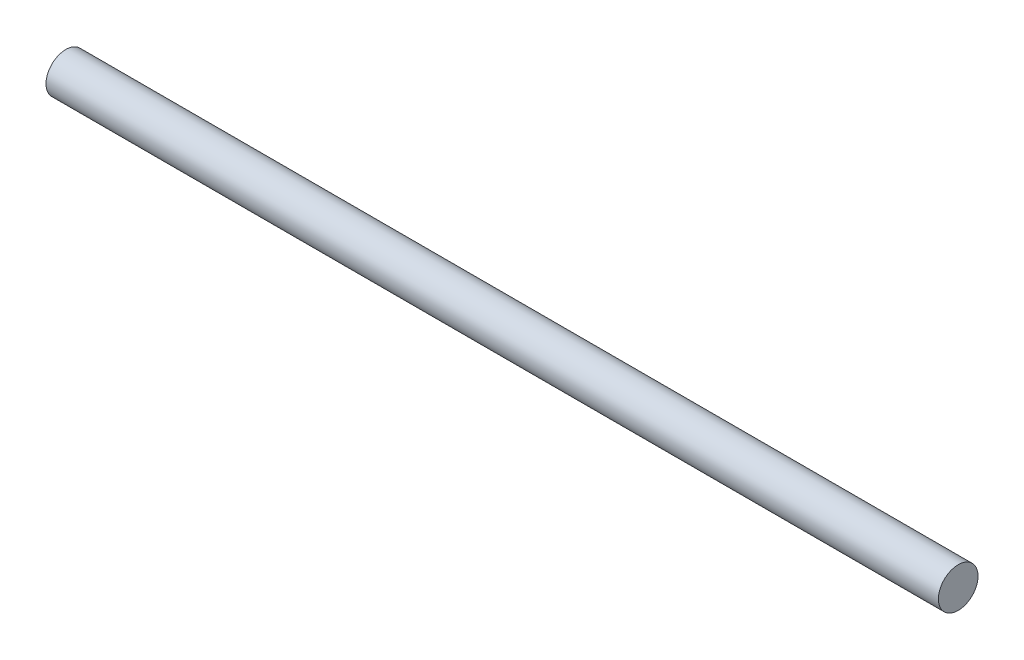
ISO-10303-21;
HEADER;
FILE_DESCRIPTION(('STEP AP214'),'2;1');
FILE_NAME('part.step','',(''),(''),'','','');
FILE_SCHEMA(('AUTOMOTIVE_DESIGN { 1 0 10303 214 1 1 1 1 }'));
ENDSEC;
DATA;
#1=APPLICATION_CONTEXT('core data for automotive mechanical design processes');
#2=APPLICATION_PROTOCOL_DEFINITION('international standard','automotive_design',2000,#1);
#3=PRODUCT_CONTEXT('',#1,'mechanical');
#4=PRODUCT('Part','Part','',(#3));
#5=PRODUCT_RELATED_PRODUCT_CATEGORY('part','',(#4));
#6=PRODUCT_DEFINITION_FORMATION('','',#4);
#7=PRODUCT_DEFINITION_CONTEXT('part definition',#1,'design');
#8=PRODUCT_DEFINITION('design','',#6,#7);
#9=PRODUCT_DEFINITION_SHAPE('','',#8);
#10=(LENGTH_UNIT() NAMED_UNIT(*) SI_UNIT(.MILLI.,.METRE.));
#11=(NAMED_UNIT(*) PLANE_ANGLE_UNIT() SI_UNIT($,.RADIAN.));
#12=(NAMED_UNIT(*) SI_UNIT($,.STERADIAN.) SOLID_ANGLE_UNIT());
#13=UNCERTAINTY_MEASURE_WITH_UNIT(LENGTH_MEASURE(1.E-05),#10,'distance_accuracy_value','');
#14=(GEOMETRIC_REPRESENTATION_CONTEXT(3) GLOBAL_UNCERTAINTY_ASSIGNED_CONTEXT((#13)) GLOBAL_UNIT_ASSIGNED_CONTEXT((#10,
#11,#12)) REPRESENTATION_CONTEXT('',''));
#15=CARTESIAN_POINT('',(0.,0.,0.));
#16=DIRECTION('',(0.,0.,1.));
#17=DIRECTION('',(1.,0.,0.));
#18=AXIS2_PLACEMENT_3D('',#15,#16,#17);
#19=CARTESIAN_POINT('',(90.,0.,0.));
#20=DIRECTION('',(-1.,0.,0.));
#21=DIRECTION('',(0.,0.,1.));
#22=AXIS2_PLACEMENT_3D('',#19,#20,#21);
#23=CYLINDRICAL_SURFACE('',#22,2.);
#24=CARTESIAN_POINT('',(90.,0.,0.));
#25=DIRECTION('',(1.,0.,0.));
#26=DIRECTION('',(0.,0.,-1.));
#27=AXIS2_PLACEMENT_3D('',#24,#25,#26);
#28=CIRCLE('',#27,2.);
#29=CARTESIAN_POINT('',(90.,0.,2.));
#30=VERTEX_POINT('',#29);
#31=EDGE_CURVE('E10',#30,#30,#28,.T.);
#32=CARTESIAN_POINT('',(0.,0.,0.));
#33=DIRECTION('',(1.,0.,0.));
#34=DIRECTION('',(0.,0.,-1.));
#35=AXIS2_PLACEMENT_3D('',#32,#33,#34);
#36=CIRCLE('',#35,2.);
#37=CARTESIAN_POINT('',(0.,0.,2.));
#38=VERTEX_POINT('',#37);
#39=EDGE_CURVE('E34',#38,#38,#36,.T.);
#40=CARTESIAN_POINT('',(90.,0.,2.));
#41=CARTESIAN_POINT('',(89.0625,0.,2.));
#42=CARTESIAN_POINT('',(88.125,0.,2.));
#43=CARTESIAN_POINT('',(86.25,0.,2.));
#44=CARTESIAN_POINT('',(85.3125,0.,2.));
#45=CARTESIAN_POINT('',(83.4375,0.,2.));
#46=CARTESIAN_POINT('',(82.5,0.,2.));
#47=CARTESIAN_POINT('',(80.625,0.,2.));
#48=CARTESIAN_POINT('',(79.6875,0.,2.));
#49=CARTESIAN_POINT('',(77.8125,0.,2.));
#50=CARTESIAN_POINT('',(76.875,0.,2.));
#51=CARTESIAN_POINT('',(75.,0.,2.));
#52=CARTESIAN_POINT('',(74.0625,0.,2.));
#53=CARTESIAN_POINT('',(72.1875,0.,2.));
#54=CARTESIAN_POINT('',(71.25,0.,2.));
#55=CARTESIAN_POINT('',(69.375,0.,2.));
#56=CARTESIAN_POINT('',(68.4375,0.,2.));
#57=CARTESIAN_POINT('',(66.5625,0.,2.));
#58=CARTESIAN_POINT('',(65.625,0.,2.));
#59=CARTESIAN_POINT('',(63.75,0.,2.));
#60=CARTESIAN_POINT('',(62.8125,0.,2.));
#61=CARTESIAN_POINT('',(60.9375,0.,2.));
#62=CARTESIAN_POINT('',(60.,0.,2.));
#63=CARTESIAN_POINT('',(58.125,0.,2.));
#64=CARTESIAN_POINT('',(57.1875,0.,2.));
#65=CARTESIAN_POINT('',(55.3125,0.,2.));
#66=CARTESIAN_POINT('',(54.375,0.,2.));
#67=CARTESIAN_POINT('',(52.5,0.,2.));
#68=CARTESIAN_POINT('',(51.5625,0.,2.));
#69=CARTESIAN_POINT('',(49.6875,0.,2.));
#70=CARTESIAN_POINT('',(48.75,0.,2.));
#71=CARTESIAN_POINT('',(46.875,0.,2.));
#72=CARTESIAN_POINT('',(45.9375,0.,2.));
#73=CARTESIAN_POINT('',(44.0625,0.,2.));
#74=CARTESIAN_POINT('',(43.125,0.,2.));
#75=CARTESIAN_POINT('',(41.25,0.,2.));
#76=CARTESIAN_POINT('',(40.3125,0.,2.));
#77=CARTESIAN_POINT('',(38.4375,0.,2.));
#78=CARTESIAN_POINT('',(37.5,0.,2.));
#79=CARTESIAN_POINT('',(35.625,0.,2.));
#80=CARTESIAN_POINT('',(34.6875,0.,2.));
#81=CARTESIAN_POINT('',(32.8125,0.,2.));
#82=CARTESIAN_POINT('',(31.875,0.,2.));
#83=CARTESIAN_POINT('',(30.,0.,2.));
#84=CARTESIAN_POINT('',(29.0625,0.,2.));
#85=CARTESIAN_POINT('',(27.1875,0.,2.));
#86=CARTESIAN_POINT('',(26.25,0.,2.));
#87=CARTESIAN_POINT('',(24.375,0.,2.));
#88=CARTESIAN_POINT('',(23.4375,0.,2.));
#89=CARTESIAN_POINT('',(21.5625,0.,2.));
#90=CARTESIAN_POINT('',(20.625,0.,2.));
#91=CARTESIAN_POINT('',(18.75,0.,2.));
#92=CARTESIAN_POINT('',(17.8125,0.,2.));
#93=CARTESIAN_POINT('',(15.9375,0.,2.));
#94=CARTESIAN_POINT('',(15.,0.,2.));
#95=CARTESIAN_POINT('',(13.125,0.,2.));
#96=CARTESIAN_POINT('',(12.1875,0.,2.));
#97=CARTESIAN_POINT('',(10.3125,0.,2.));
#98=CARTESIAN_POINT('',(9.37499999999999,0.,2.));
#99=CARTESIAN_POINT('',(7.49999999999999,0.,2.));
#100=CARTESIAN_POINT('',(6.56249999999999,0.,2.));
#101=CARTESIAN_POINT('',(4.68749999999999,0.,2.));
#102=CARTESIAN_POINT('',(3.74999999999998,0.,2.));
#103=CARTESIAN_POINT('',(1.87499999999998,0.,2.));
#104=CARTESIAN_POINT('',(0.937499999999986,0.,2.));
#105=CARTESIAN_POINT('',(0.,0.,2.));
#106=B_SPLINE_CURVE_WITH_KNOTS('',3,(#40,#41,#42,#43,#44,#45,#46,#47,#48,#49,#50,#51,#52,#53,
#54,#55,#56,#57,#58,#59,#60,#61,#62,#63,#64,#65,#66,#67,#68,#69,#70,#71,#72,#73,#74,#75,#76,#77,
#78,#79,#80,#81,#82,#83,#84,#85,#86,#87,#88,#89,#90,#91,#92,#93,#94,#95,#96,#97,#98,#99,#100,
#101,#102,#103,#104,#105),.UNSPECIFIED.,.F.,.F.,(4,2,2,2,2,2,2,2,2,2,2,2,2,2,2,2,2,2,2,2,2,2,2,
2,2,2,2,2,2,2,2,2,4),(0.,2.8125,5.62499999999999,8.43749999999999,11.25,14.0625,16.875,19.6875,
22.5,25.3125,28.125,30.9375,33.75,36.5625,39.375,42.1875,45.,47.8125,50.625,53.4375,56.25,
59.0625,61.875,64.6875,67.5,70.3125,73.125,75.9375,78.75,81.5625,84.375,87.1875,90.),.UNSPECIFIED.);
#107=EDGE_CURVE('BSEAM31',#30,#38,#106,.T.);
#108=ORIENTED_EDGE('',*,*,#31,.F.);
#109=ORIENTED_EDGE('',*,*,#39,.T.);
#110=ORIENTED_EDGE('',*,*,#107,.T.);
#111=ORIENTED_EDGE('',*,*,#107,.F.);
#112=EDGE_LOOP('',(#108,#110,#109,#111));
#113=FACE_BOUND('',#112,.T.);
#114=ADVANCED_FACE('F31',(#113),#23,.T.);
#115=CARTESIAN_POINT('',(90.,0.,0.));
#116=DIRECTION('',(1.,0.,0.));
#117=DIRECTION('',(0.,0.,-1.));
#118=AXIS2_PLACEMENT_3D('',#115,#116,#117);
#119=PLANE('',#118);
#120=ORIENTED_EDGE('',*,*,#31,.T.);
#121=EDGE_LOOP('',(#120));
#122=FACE_BOUND('',#121,.T.);
#123=ADVANCED_FACE('F46',(#122),#119,.T.);
#124=CARTESIAN_POINT('',(0.,0.,0.));
#125=DIRECTION('',(1.,0.,0.));
#126=DIRECTION('',(0.,0.,-1.));
#127=AXIS2_PLACEMENT_3D('',#124,#125,#126);
#128=PLANE('',#127);
#129=ORIENTED_EDGE('',*,*,#39,.F.);
#130=EDGE_LOOP('',(#129));
#131=FACE_BOUND('',#130,.T.);
#132=ADVANCED_FACE('F44',(#131),#128,.F.);
#133=CLOSED_SHELL('',(#114,#123,#132));
#134=MANIFOLD_SOLID_BREP('B2',#133);
#135=ADVANCED_BREP_SHAPE_REPRESENTATION('',(#18,#134),#14);
#136=SHAPE_DEFINITION_REPRESENTATION(#9,#135);
ENDSEC;
END-ISO-10303-21;
